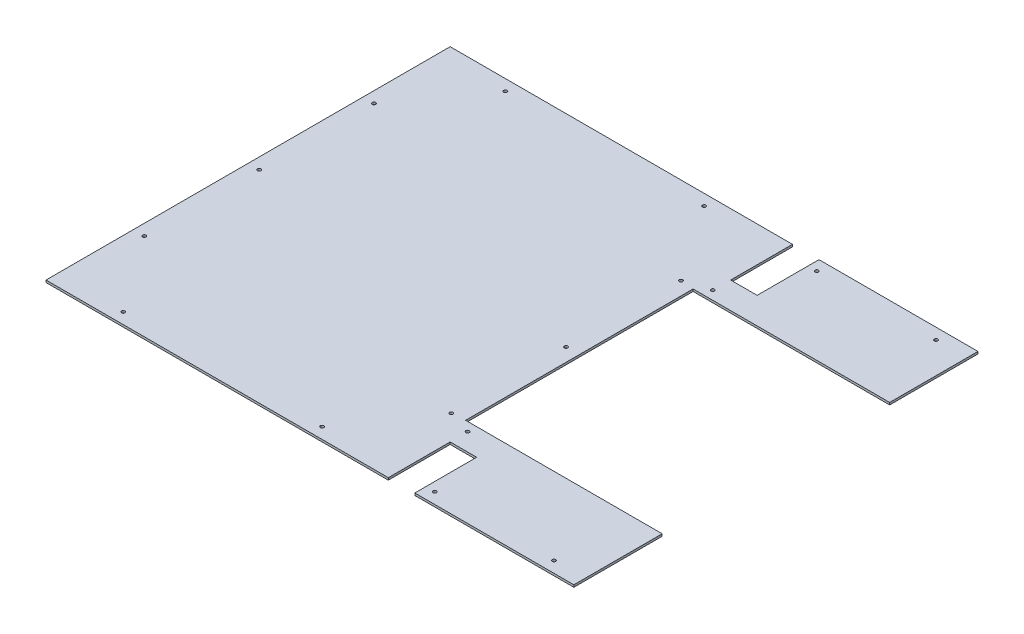
ISO-10303-21;
HEADER;
FILE_DESCRIPTION(('STEP AP214'),'2;1');
FILE_NAME('part.step','',(''),(''),'','','');
FILE_SCHEMA(('AUTOMOTIVE_DESIGN { 1 0 10303 214 1 1 1 1 }'));
ENDSEC;
DATA;
#1=APPLICATION_CONTEXT('core data for automotive mechanical design processes');
#2=APPLICATION_PROTOCOL_DEFINITION('international standard','automotive_design',2000,#1);
#3=PRODUCT_CONTEXT('',#1,'mechanical');
#4=PRODUCT('Part','Part','',(#3));
#5=PRODUCT_RELATED_PRODUCT_CATEGORY('part','',(#4));
#6=PRODUCT_DEFINITION_FORMATION('','',#4);
#7=PRODUCT_DEFINITION_CONTEXT('part definition',#1,'design');
#8=PRODUCT_DEFINITION('design','',#6,#7);
#9=PRODUCT_DEFINITION_SHAPE('','',#8);
#10=(LENGTH_UNIT() NAMED_UNIT(*) SI_UNIT(.MILLI.,.METRE.));
#11=(NAMED_UNIT(*) PLANE_ANGLE_UNIT() SI_UNIT($,.RADIAN.));
#12=(NAMED_UNIT(*) SI_UNIT($,.STERADIAN.) SOLID_ANGLE_UNIT());
#13=UNCERTAINTY_MEASURE_WITH_UNIT(LENGTH_MEASURE(1.E-05),#10,'distance_accuracy_value','');
#14=(GEOMETRIC_REPRESENTATION_CONTEXT(3) GLOBAL_UNCERTAINTY_ASSIGNED_CONTEXT((#13)) GLOBAL_UNIT_ASSIGNED_CONTEXT((#10,
#11,#12)) REPRESENTATION_CONTEXT('',''));
#15=CARTESIAN_POINT('',(0.,0.,0.));
#16=DIRECTION('',(0.,0.,1.));
#17=DIRECTION('',(1.,0.,0.));
#18=AXIS2_PLACEMENT_3D('',#15,#16,#17);
#19=CARTESIAN_POINT('',(0.,0.,0.));
#20=DIRECTION('',(0.,-1.,0.));
#21=DIRECTION('',(0.,0.,-1.));
#22=AXIS2_PLACEMENT_3D('',#19,#20,#21);
#23=PLANE('',#22);
#24=CARTESIAN_POINT('',(491.8075,0.,-114.3));
#25=DIRECTION('',(0.,1.,0.));
#26=DIRECTION('',(0.,0.,1.));
#27=AXIS2_PLACEMENT_3D('',#24,#25,#26);
#28=CIRCLE('',#27,2.45744999999997);
#29=CARTESIAN_POINT('',(491.8075,0.,-111.84255));
#30=VERTEX_POINT('',#29);
#31=EDGE_CURVE('E532',#30,#30,#28,.T.);
#32=ORIENTED_EDGE('',*,*,#31,.T.);
#33=EDGE_LOOP('',(#32));
#34=FACE_BOUND('',#33,.T.);
#35=CARTESIAN_POINT('',(542.925,0.,-15.875));
#36=DIRECTION('',(0.,1.,0.));
#37=DIRECTION('',(0.,0.,1.));
#38=AXIS2_PLACEMENT_3D('',#35,#36,#37);
#39=CIRCLE('',#38,2.45744999999997);
#40=CARTESIAN_POINT('',(542.925,0.,-13.41755));
#41=VERTEX_POINT('',#40);
#42=EDGE_CURVE('E537',#41,#41,#39,.T.);
#43=ORIENTED_EDGE('',*,*,#42,.T.);
#44=EDGE_LOOP('',(#43));
#45=FACE_BOUND('',#44,.T.);
#46=CARTESIAN_POINT('',(714.375,0.,-15.875));
#47=DIRECTION('',(0.,1.,0.));
#48=DIRECTION('',(0.,0.,1.));
#49=AXIS2_PLACEMENT_3D('',#46,#47,#48);
#50=CIRCLE('',#49,2.45744999999997);
#51=CARTESIAN_POINT('',(714.375,0.,-13.41755));
#52=VERTEX_POINT('',#51);
#53=EDGE_CURVE('E541',#52,#52,#50,.T.);
#54=ORIENTED_EDGE('',*,*,#53,.T.);
#55=EDGE_LOOP('',(#54));
#56=FACE_BOUND('',#55,.T.);
#57=CARTESIAN_POINT('',(491.8075,0.,-466.725));
#58=DIRECTION('',(0.,1.,0.));
#59=DIRECTION('',(0.,0.,1.));
#60=AXIS2_PLACEMENT_3D('',#57,#58,#59);
#61=CIRCLE('',#60,2.45744999999997);
#62=CARTESIAN_POINT('',(491.8075,0.,-464.26755));
#63=VERTEX_POINT('',#62);
#64=EDGE_CURVE('E545',#63,#63,#61,.T.);
#65=ORIENTED_EDGE('',*,*,#64,.T.);
#66=EDGE_LOOP('',(#65));
#67=FACE_BOUND('',#66,.T.);
#68=CARTESIAN_POINT('',(15.875,0.,-290.5125));
#69=DIRECTION('',(0.,1.,0.));
#70=DIRECTION('',(0.,0.,1.));
#71=AXIS2_PLACEMENT_3D('',#68,#69,#70);
#72=CIRCLE('',#71,2.45745);
#73=CARTESIAN_POINT('',(15.875,0.,-288.05505));
#74=VERTEX_POINT('',#73);
#75=EDGE_CURVE('E316',#74,#74,#72,.T.);
#76=ORIENTED_EDGE('',*,*,#75,.T.);
#77=EDGE_LOOP('',(#76));
#78=FACE_BOUND('',#77,.T.);
#79=CARTESIAN_POINT('',(381.,0.,-15.875));
#80=DIRECTION('',(0.,1.,0.));
#81=DIRECTION('',(0.,0.,1.));
#82=AXIS2_PLACEMENT_3D('',#79,#80,#81);
#83=CIRCLE('',#82,2.45744999999997);
#84=CARTESIAN_POINT('',(381.,0.,-13.41755));
#85=VERTEX_POINT('',#84);
#86=EDGE_CURVE('E322',#85,#85,#83,.T.);
#87=ORIENTED_EDGE('',*,*,#86,.T.);
#88=EDGE_LOOP('',(#87));
#89=FACE_BOUND('',#88,.T.);
#90=CARTESIAN_POINT('',(381.,0.,-565.15));
#91=DIRECTION('',(0.,1.,0.));
#92=DIRECTION('',(0.,0.,1.));
#93=AXIS2_PLACEMENT_3D('',#90,#91,#92);
#94=CIRCLE('',#93,2.45744999999997);
#95=CARTESIAN_POINT('',(381.,0.,-562.69255));
#96=VERTEX_POINT('',#95);
#97=EDGE_CURVE('E328',#96,#96,#94,.T.);
#98=ORIENTED_EDGE('',*,*,#97,.T.);
#99=EDGE_LOOP('',(#98));
#100=FACE_BOUND('',#99,.T.);
#101=CARTESIAN_POINT('',(95.25,0.,-565.15));
#102=DIRECTION('',(0.,1.,0.));
#103=DIRECTION('',(0.,0.,1.));
#104=AXIS2_PLACEMENT_3D('',#101,#102,#103);
#105=CIRCLE('',#104,2.45745);
#106=CARTESIAN_POINT('',(95.25,0.,-562.69255));
#107=VERTEX_POINT('',#106);
#108=EDGE_CURVE('E334',#107,#107,#105,.T.);
#109=ORIENTED_EDGE('',*,*,#108,.T.);
#110=EDGE_LOOP('',(#109));
#111=FACE_BOUND('',#110,.T.);
#112=CARTESIAN_POINT('',(95.2500000000001,0.,-15.875));
#113=DIRECTION('',(0.,1.,0.));
#114=DIRECTION('',(0.,0.,1.));
#115=AXIS2_PLACEMENT_3D('',#112,#113,#114);
#116=CIRCLE('',#115,2.45745);
#117=CARTESIAN_POINT('',(95.2500000000001,0.,-13.41755));
#118=VERTEX_POINT('',#117);
#119=EDGE_CURVE('E340',#118,#118,#116,.T.);
#120=ORIENTED_EDGE('',*,*,#119,.T.);
#121=EDGE_LOOP('',(#120));
#122=FACE_BOUND('',#121,.T.);
#123=CARTESIAN_POINT('',(457.2,0.,-125.4125));
#124=DIRECTION('',(0.,1.,0.));
#125=DIRECTION('',(0.,0.,1.));
#126=AXIS2_PLACEMENT_3D('',#123,#124,#125);
#127=CIRCLE('',#126,2.45744999999997);
#128=CARTESIAN_POINT('',(457.2,0.,-122.95505));
#129=VERTEX_POINT('',#128);
#130=EDGE_CURVE('E346',#129,#129,#127,.T.);
#131=ORIENTED_EDGE('',*,*,#130,.T.);
#132=EDGE_LOOP('',(#131));
#133=FACE_BOUND('',#132,.T.);
#134=CARTESIAN_POINT('',(457.2,0.,-455.6125));
#135=DIRECTION('',(0.,1.,0.));
#136=DIRECTION('',(0.,0.,1.));
#137=AXIS2_PLACEMENT_3D('',#134,#135,#136);
#138=CIRCLE('',#137,2.45744999999997);
#139=CARTESIAN_POINT('',(457.2,0.,-453.15505));
#140=VERTEX_POINT('',#139);
#141=EDGE_CURVE('E265',#140,#140,#138,.T.);
#142=ORIENTED_EDGE('',*,*,#141,.T.);
#143=EDGE_LOOP('',(#142));
#144=FACE_BOUND('',#143,.T.);
#145=CARTESIAN_POINT('',(457.2,0.,-290.5125));
#146=DIRECTION('',(0.,1.,0.));
#147=DIRECTION('',(0.,0.,1.));
#148=AXIS2_PLACEMENT_3D('',#145,#146,#147);
#149=CIRCLE('',#148,2.45744999999997);
#150=CARTESIAN_POINT('',(457.2,0.,-288.05505));
#151=VERTEX_POINT('',#150);
#152=EDGE_CURVE('E352',#151,#151,#149,.T.);
#153=ORIENTED_EDGE('',*,*,#152,.T.);
#154=EDGE_LOOP('',(#153));
#155=FACE_BOUND('',#154,.T.);
#156=CARTESIAN_POINT('',(15.875,0.,-125.4125));
#157=DIRECTION('',(0.,1.,0.));
#158=DIRECTION('',(0.,0.,1.));
#159=AXIS2_PLACEMENT_3D('',#156,#157,#158);
#160=CIRCLE('',#159,2.45745);
#161=CARTESIAN_POINT('',(15.875,0.,-122.95505));
#162=VERTEX_POINT('',#161);
#163=EDGE_CURVE('E310',#162,#162,#160,.T.);
#164=ORIENTED_EDGE('',*,*,#163,.T.);
#165=EDGE_LOOP('',(#164));
#166=FACE_BOUND('',#165,.T.);
#167=CARTESIAN_POINT('',(15.875,0.,-455.6125));
#168=DIRECTION('',(0.,1.,0.));
#169=DIRECTION('',(0.,0.,1.));
#170=AXIS2_PLACEMENT_3D('',#167,#168,#169);
#171=CIRCLE('',#170,2.45745);
#172=CARTESIAN_POINT('',(15.875,0.,-453.15505));
#173=VERTEX_POINT('',#172);
#174=EDGE_CURVE('E304',#173,#173,#171,.T.);
#175=ORIENTED_EDGE('',*,*,#174,.T.);
#176=EDGE_LOOP('',(#175));
#177=FACE_BOUND('',#176,.T.);
#178=DIRECTION('',(0.,0.,1.));
#179=VECTOR('',#178,1.);
#180=CARTESIAN_POINT('',(492.125,0.,0.));
#181=LINE('',#180,#179);
#182=CARTESIAN_POINT('',(492.125,0.,-88.9));
#183=VERTEX_POINT('',#182);
#184=CARTESIAN_POINT('',(492.125,0.,0.));
#185=VERTEX_POINT('',#184);
#186=EDGE_CURVE('E149',#183,#185,#181,.T.);
#187=ORIENTED_EDGE('',*,*,#186,.T.);
#188=DIRECTION('',(1.,0.,0.));
#189=VECTOR('',#188,1.);
#190=CARTESIAN_POINT('',(447.675,0.,0.));
#191=LINE('',#190,#189);
#192=CARTESIAN_POINT('',(0.,0.,0.));
#193=VERTEX_POINT('',#192);
#194=EDGE_CURVE('E162',#193,#185,#191,.T.);
#195=ORIENTED_EDGE('',*,*,#194,.F.);
#196=DIRECTION('',(0.,0.,1.));
#197=VECTOR('',#196,1.);
#198=CARTESIAN_POINT('',(0.,0.,0.));
#199=LINE('',#198,#197);
#200=CARTESIAN_POINT('',(0.,0.,-581.025));
#201=VERTEX_POINT('',#200);
#202=EDGE_CURVE('E174',#201,#193,#199,.T.);
#203=ORIENTED_EDGE('',*,*,#202,.F.);
#204=DIRECTION('',(-1.,0.,0.));
#205=VECTOR('',#204,1.);
#206=CARTESIAN_POINT('',(0.,0.,-581.025));
#207=LINE('',#206,#205);
#208=CARTESIAN_POINT('',(492.125,0.,-581.025));
#209=VERTEX_POINT('',#208);
#210=EDGE_CURVE('E186',#209,#201,#207,.T.);
#211=ORIENTED_EDGE('',*,*,#210,.F.);
#212=DIRECTION('',(0.,0.,1.));
#213=VECTOR('',#212,1.);
#214=CARTESIAN_POINT('',(492.125,0.,-581.025));
#215=LINE('',#214,#213);
#216=CARTESIAN_POINT('',(492.125,0.,-492.125));
#217=VERTEX_POINT('',#216);
#218=EDGE_CURVE('E278',#209,#217,#215,.T.);
#219=ORIENTED_EDGE('',*,*,#218,.T.);
#220=DIRECTION('',(1.,0.,0.));
#221=VECTOR('',#220,1.);
#222=CARTESIAN_POINT('',(492.125,0.,-492.125));
#223=LINE('',#222,#221);
#224=CARTESIAN_POINT('',(530.225,0.,-492.125));
#225=VERTEX_POINT('',#224);
#226=EDGE_CURVE('E281',#217,#225,#223,.T.);
#227=ORIENTED_EDGE('',*,*,#226,.T.);
#228=DIRECTION('',(0.,0.,-1.));
#229=VECTOR('',#228,1.);
#230=CARTESIAN_POINT('',(530.225,0.,-581.025));
#231=LINE('',#230,#229);
#232=CARTESIAN_POINT('',(530.225,0.,-581.025));
#233=VERTEX_POINT('',#232);
#234=EDGE_CURVE('E284',#225,#233,#231,.T.);
#235=ORIENTED_EDGE('',*,*,#234,.T.);
#236=CARTESIAN_POINT('',(758.825,0.,-581.025));
#237=VERTEX_POINT('',#236);
#238=EDGE_CURVE('E187',#237,#233,#207,.T.);
#239=ORIENTED_EDGE('',*,*,#238,.F.);
#240=DIRECTION('',(0.,0.,-1.));
#241=VECTOR('',#240,1.);
#242=CARTESIAN_POINT('',(758.825,0.,-581.025));
#243=LINE('',#242,#241);
#244=CARTESIAN_POINT('',(758.825,0.,-454.025));
#245=VERTEX_POINT('',#244);
#246=EDGE_CURVE('E183',#245,#237,#243,.T.);
#247=ORIENTED_EDGE('',*,*,#246,.F.);
#248=DIRECTION('',(1.,0.,0.));
#249=VECTOR('',#248,1.);
#250=CARTESIAN_POINT('',(758.825,0.,-454.025));
#251=LINE('',#250,#249);
#252=CARTESIAN_POINT('',(476.25,0.,-454.025));
#253=VERTEX_POINT('',#252);
#254=EDGE_CURVE('E181',#253,#245,#251,.T.);
#255=ORIENTED_EDGE('',*,*,#254,.F.);
#256=DIRECTION('',(0.,0.,-1.));
#257=VECTOR('',#256,1.);
#258=CARTESIAN_POINT('',(476.25,0.,-127.));
#259=LINE('',#258,#257);
#260=CARTESIAN_POINT('',(476.25,0.,-127.));
#261=VERTEX_POINT('',#260);
#262=EDGE_CURVE('E179',#261,#253,#259,.T.);
#263=ORIENTED_EDGE('',*,*,#262,.F.);
#264=DIRECTION('',(-1.,0.,0.));
#265=VECTOR('',#264,1.);
#266=CARTESIAN_POINT('',(758.825,0.,-127.));
#267=LINE('',#266,#265);
#268=CARTESIAN_POINT('',(758.825,0.,-127.));
#269=VERTEX_POINT('',#268);
#270=EDGE_CURVE('E172',#269,#261,#267,.T.);
#271=ORIENTED_EDGE('',*,*,#270,.F.);
#272=DIRECTION('',(0.,0.,-1.));
#273=VECTOR('',#272,1.);
#274=CARTESIAN_POINT('',(758.825,0.,0.));
#275=LINE('',#274,#273);
#276=CARTESIAN_POINT('',(758.825,0.,0.));
#277=VERTEX_POINT('',#276);
#278=EDGE_CURVE('E169',#277,#269,#275,.T.);
#279=ORIENTED_EDGE('',*,*,#278,.F.);
#280=CARTESIAN_POINT('',(530.225,0.,0.));
#281=VERTEX_POINT('',#280);
#282=EDGE_CURVE('E170',#281,#277,#191,.T.);
#283=ORIENTED_EDGE('',*,*,#282,.F.);
#284=DIRECTION('',(0.,0.,-1.));
#285=VECTOR('',#284,1.);
#286=CARTESIAN_POINT('',(530.225,0.,0.));
#287=LINE('',#286,#285);
#288=CARTESIAN_POINT('',(530.225,0.,-88.9));
#289=VERTEX_POINT('',#288);
#290=EDGE_CURVE('E48',#281,#289,#287,.T.);
#291=ORIENTED_EDGE('',*,*,#290,.T.);
#292=DIRECTION('',(-1.,0.,0.));
#293=VECTOR('',#292,1.);
#294=CARTESIAN_POINT('',(492.125,0.,-88.9));
#295=LINE('',#294,#293);
#296=EDGE_CURVE('E157',#289,#183,#295,.T.);
#297=ORIENTED_EDGE('',*,*,#296,.T.);
#298=EDGE_LOOP('',(#187,#195,#203,#211,#219,#227,#235,#239,#247,#255,#263,#271,#279,#283,#291,#297));
#299=FACE_BOUND('',#298,.T.);
#300=CARTESIAN_POINT('',(714.375,0.,-565.15));
#301=DIRECTION('',(0.,1.,0.));
#302=DIRECTION('',(0.,0.,1.));
#303=AXIS2_PLACEMENT_3D('',#300,#301,#302);
#304=CIRCLE('',#303,2.45744999999997);
#305=CARTESIAN_POINT('',(714.375,0.,-562.69255));
#306=VERTEX_POINT('',#305);
#307=EDGE_CURVE('E290',#306,#306,#304,.T.);
#308=ORIENTED_EDGE('',*,*,#307,.T.);
#309=EDGE_LOOP('',(#308));
#310=FACE_BOUND('',#309,.T.);
#311=CARTESIAN_POINT('',(542.925,0.,-565.15));
#312=DIRECTION('',(0.,1.,0.));
#313=DIRECTION('',(0.,0.,1.));
#314=AXIS2_PLACEMENT_3D('',#311,#312,#313);
#315=CIRCLE('',#314,2.45744999999997);
#316=CARTESIAN_POINT('',(542.925,0.,-562.69255));
#317=VERTEX_POINT('',#316);
#318=EDGE_CURVE('E549',#317,#317,#315,.T.);
#319=ORIENTED_EDGE('',*,*,#318,.T.);
#320=EDGE_LOOP('',(#319));
#321=FACE_BOUND('',#320,.T.);
#322=ADVANCED_FACE('F33',(#34,#45,#56,#67,#78,#89,#100,#111,#122,#133,#144,#155,#166,#177,#299,
#310,#321),#23,.T.);
#323=CARTESIAN_POINT('',(447.675,3.175,0.));
#324=DIRECTION('',(0.,0.,-1.));
#325=DIRECTION('',(-1.,0.,0.));
#326=AXIS2_PLACEMENT_3D('',#323,#324,#325);
#327=PLANE('',#326);
#328=ORIENTED_EDGE('',*,*,#194,.T.);
#329=DIRECTION('',(0.,1.,0.));
#330=VECTOR('',#329,1.);
#331=CARTESIAN_POINT('',(492.125,0.,0.));
#332=LINE('',#331,#330);
#333=CARTESIAN_POINT('',(492.125,3.175,0.));
#334=VERTEX_POINT('',#333);
#335=EDGE_CURVE('E146',#185,#334,#332,.T.);
#336=ORIENTED_EDGE('',*,*,#335,.T.);
#337=DIRECTION('',(1.,0.,0.));
#338=VECTOR('',#337,1.);
#339=CARTESIAN_POINT('',(0.,3.175,0.));
#340=LINE('',#339,#338);
#341=CARTESIAN_POINT('',(0.,3.175,0.));
#342=VERTEX_POINT('',#341);
#343=EDGE_CURVE('E262',#342,#334,#340,.T.);
#344=ORIENTED_EDGE('',*,*,#343,.F.);
#345=DIRECTION('',(0.,-1.,0.));
#346=VECTOR('',#345,1.);
#347=CARTESIAN_POINT('',(0.,3.175,0.));
#348=LINE('',#347,#346);
#349=EDGE_CURVE('E11',#342,#193,#348,.T.);
#350=ORIENTED_EDGE('',*,*,#349,.T.);
#351=EDGE_LOOP('',(#328,#336,#344,#350));
#352=FACE_BOUND('',#351,.T.);
#353=ADVANCED_FACE('F166',(#352),#327,.F.);
#354=CARTESIAN_POINT('',(0.,3.175,-581.025));
#355=DIRECTION('',(0.,0.,1.));
#356=DIRECTION('',(1.,0.,0.));
#357=AXIS2_PLACEMENT_3D('',#354,#355,#356);
#358=PLANE('',#357);
#359=DIRECTION('',(-1.,0.,0.));
#360=VECTOR('',#359,1.);
#361=CARTESIAN_POINT('',(476.25,3.175,-581.025));
#362=LINE('',#361,#360);
#363=CARTESIAN_POINT('',(492.125,3.175,-581.025));
#364=VERTEX_POINT('',#363);
#365=CARTESIAN_POINT('',(0.,3.175,-581.025));
#366=VERTEX_POINT('',#365);
#367=EDGE_CURVE('E242',#364,#366,#362,.T.);
#368=ORIENTED_EDGE('',*,*,#367,.F.);
#369=DIRECTION('',(0.,1.,0.));
#370=VECTOR('',#369,1.);
#371=CARTESIAN_POINT('',(492.125,0.,-581.025));
#372=LINE('',#371,#370);
#373=EDGE_CURVE('E294',#209,#364,#372,.T.);
#374=ORIENTED_EDGE('',*,*,#373,.F.);
#375=ORIENTED_EDGE('',*,*,#210,.T.);
#376=DIRECTION('',(0.,-1.,0.));
#377=VECTOR('',#376,1.);
#378=CARTESIAN_POINT('',(0.,3.175,-581.025));
#379=LINE('',#378,#377);
#380=EDGE_CURVE('E191',#366,#201,#379,.T.);
#381=ORIENTED_EDGE('',*,*,#380,.F.);
#382=EDGE_LOOP('',(#368,#374,#375,#381));
#383=FACE_BOUND('',#382,.T.);
#384=ADVANCED_FACE('F257',(#383),#358,.F.);
#385=CARTESIAN_POINT('',(0.,3.175,0.));
#386=DIRECTION('',(0.,-1.,0.));
#387=DIRECTION('',(0.,0.,-1.));
#388=AXIS2_PLACEMENT_3D('',#385,#386,#387);
#389=PLANE('',#388);
#390=CARTESIAN_POINT('',(491.8075,3.175,-114.3));
#391=DIRECTION('',(0.,1.,0.));
#392=DIRECTION('',(0.,0.,1.));
#393=AXIS2_PLACEMENT_3D('',#390,#391,#392);
#394=CIRCLE('',#393,2.45744999999997);
#395=CARTESIAN_POINT('',(491.8075,3.175,-111.84255));
#396=VERTEX_POINT('',#395);
#397=EDGE_CURVE('E415',#396,#396,#394,.T.);
#398=ORIENTED_EDGE('',*,*,#397,.F.);
#399=EDGE_LOOP('',(#398));
#400=FACE_BOUND('',#399,.T.);
#401=CARTESIAN_POINT('',(542.925,3.175,-15.875));
#402=DIRECTION('',(0.,1.,0.));
#403=DIRECTION('',(0.,0.,1.));
#404=AXIS2_PLACEMENT_3D('',#401,#402,#403);
#405=CIRCLE('',#404,2.45744999999997);
#406=CARTESIAN_POINT('',(542.925,3.175,-13.41755));
#407=VERTEX_POINT('',#406);
#408=EDGE_CURVE('E419',#407,#407,#405,.T.);
#409=ORIENTED_EDGE('',*,*,#408,.F.);
#410=EDGE_LOOP('',(#409));
#411=FACE_BOUND('',#410,.T.);
#412=CARTESIAN_POINT('',(714.375,3.175,-15.875));
#413=DIRECTION('',(0.,1.,0.));
#414=DIRECTION('',(0.,0.,1.));
#415=AXIS2_PLACEMENT_3D('',#412,#413,#414);
#416=CIRCLE('',#415,2.45744999999997);
#417=CARTESIAN_POINT('',(714.375,3.175,-13.41755));
#418=VERTEX_POINT('',#417);
#419=EDGE_CURVE('E423',#418,#418,#416,.T.);
#420=ORIENTED_EDGE('',*,*,#419,.F.);
#421=EDGE_LOOP('',(#420));
#422=FACE_BOUND('',#421,.T.);
#423=CARTESIAN_POINT('',(491.8075,3.175,-466.725));
#424=DIRECTION('',(0.,1.,0.));
#425=DIRECTION('',(0.,0.,1.));
#426=AXIS2_PLACEMENT_3D('',#423,#424,#425);
#427=CIRCLE('',#426,2.45744999999997);
#428=CARTESIAN_POINT('',(491.8075,3.175,-464.26755));
#429=VERTEX_POINT('',#428);
#430=EDGE_CURVE('E427',#429,#429,#427,.T.);
#431=ORIENTED_EDGE('',*,*,#430,.F.);
#432=EDGE_LOOP('',(#431));
#433=FACE_BOUND('',#432,.T.);
#434=CARTESIAN_POINT('',(542.925,3.175,-565.15));
#435=DIRECTION('',(0.,1.,0.));
#436=DIRECTION('',(0.,0.,1.));
#437=AXIS2_PLACEMENT_3D('',#434,#435,#436);
#438=CIRCLE('',#437,2.45744999999997);
#439=CARTESIAN_POINT('',(542.925,3.175,-562.69255));
#440=VERTEX_POINT('',#439);
#441=EDGE_CURVE('E431',#440,#440,#438,.T.);
#442=ORIENTED_EDGE('',*,*,#441,.F.);
#443=EDGE_LOOP('',(#442));
#444=FACE_BOUND('',#443,.T.);
#445=CARTESIAN_POINT('',(714.375,3.175,-565.15));
#446=DIRECTION('',(0.,1.,0.));
#447=DIRECTION('',(0.,0.,1.));
#448=AXIS2_PLACEMENT_3D('',#445,#446,#447);
#449=CIRCLE('',#448,2.45744999999997);
#450=CARTESIAN_POINT('',(714.375,3.175,-562.69255));
#451=VERTEX_POINT('',#450);
#452=EDGE_CURVE('E435',#451,#451,#449,.T.);
#453=ORIENTED_EDGE('',*,*,#452,.F.);
#454=EDGE_LOOP('',(#453));
#455=FACE_BOUND('',#454,.T.);
#456=CARTESIAN_POINT('',(15.875,3.175,-125.4125));
#457=DIRECTION('',(0.,1.,0.));
#458=DIRECTION('',(0.,0.,1.));
#459=AXIS2_PLACEMENT_3D('',#456,#457,#458);
#460=CIRCLE('',#459,2.45744999999999);
#461=CARTESIAN_POINT('',(15.875,3.175,-122.95505));
#462=VERTEX_POINT('',#461);
#463=EDGE_CURVE('E307',#462,#462,#460,.T.);
#464=ORIENTED_EDGE('',*,*,#463,.F.);
#465=EDGE_LOOP('',(#464));
#466=FACE_BOUND('',#465,.T.);
#467=CARTESIAN_POINT('',(381.,3.175,-15.875));
#468=DIRECTION('',(0.,1.,0.));
#469=DIRECTION('',(0.,0.,1.));
#470=AXIS2_PLACEMENT_3D('',#467,#468,#469);
#471=CIRCLE('',#470,2.45744999999997);
#472=CARTESIAN_POINT('',(381.,3.175,-13.41755));
#473=VERTEX_POINT('',#472);
#474=EDGE_CURVE('E319',#473,#473,#471,.T.);
#475=ORIENTED_EDGE('',*,*,#474,.F.);
#476=EDGE_LOOP('',(#475));
#477=FACE_BOUND('',#476,.T.);
#478=CARTESIAN_POINT('',(381.,3.175,-565.15));
#479=DIRECTION('',(0.,1.,0.));
#480=DIRECTION('',(0.,0.,1.));
#481=AXIS2_PLACEMENT_3D('',#478,#479,#480);
#482=CIRCLE('',#481,2.45744999999997);
#483=CARTESIAN_POINT('',(381.,3.175,-562.69255));
#484=VERTEX_POINT('',#483);
#485=EDGE_CURVE('E325',#484,#484,#482,.T.);
#486=ORIENTED_EDGE('',*,*,#485,.F.);
#487=EDGE_LOOP('',(#486));
#488=FACE_BOUND('',#487,.T.);
#489=CARTESIAN_POINT('',(95.25,3.175,-565.15));
#490=DIRECTION('',(0.,1.,0.));
#491=DIRECTION('',(0.,0.,1.));
#492=AXIS2_PLACEMENT_3D('',#489,#490,#491);
#493=CIRCLE('',#492,2.45744999999999);
#494=CARTESIAN_POINT('',(95.25,3.175,-562.69255));
#495=VERTEX_POINT('',#494);
#496=EDGE_CURVE('E331',#495,#495,#493,.T.);
#497=ORIENTED_EDGE('',*,*,#496,.F.);
#498=EDGE_LOOP('',(#497));
#499=FACE_BOUND('',#498,.T.);
#500=CARTESIAN_POINT('',(95.2500000000001,3.175,-15.875));
#501=DIRECTION('',(0.,1.,0.));
#502=DIRECTION('',(0.,0.,1.));
#503=AXIS2_PLACEMENT_3D('',#500,#501,#502);
#504=CIRCLE('',#503,2.45744999999999);
#505=CARTESIAN_POINT('',(95.2500000000001,3.175,-13.41755));
#506=VERTEX_POINT('',#505);
#507=EDGE_CURVE('E337',#506,#506,#504,.T.);
#508=ORIENTED_EDGE('',*,*,#507,.F.);
#509=EDGE_LOOP('',(#508));
#510=FACE_BOUND('',#509,.T.);
#511=CARTESIAN_POINT('',(457.2,3.175,-125.4125));
#512=DIRECTION('',(0.,1.,0.));
#513=DIRECTION('',(0.,0.,1.));
#514=AXIS2_PLACEMENT_3D('',#511,#512,#513);
#515=CIRCLE('',#514,2.45744999999997);
#516=CARTESIAN_POINT('',(457.2,3.175,-122.95505));
#517=VERTEX_POINT('',#516);
#518=EDGE_CURVE('E343',#517,#517,#515,.T.);
#519=ORIENTED_EDGE('',*,*,#518,.F.);
#520=EDGE_LOOP('',(#519));
#521=FACE_BOUND('',#520,.T.);
#522=CARTESIAN_POINT('',(457.2,3.175,-290.5125));
#523=DIRECTION('',(0.,1.,0.));
#524=DIRECTION('',(0.,0.,1.));
#525=AXIS2_PLACEMENT_3D('',#522,#523,#524);
#526=CIRCLE('',#525,2.45744999999997);
#527=CARTESIAN_POINT('',(457.2,3.175,-288.05505));
#528=VERTEX_POINT('',#527);
#529=EDGE_CURVE('E349',#528,#528,#526,.T.);
#530=ORIENTED_EDGE('',*,*,#529,.F.);
#531=EDGE_LOOP('',(#530));
#532=FACE_BOUND('',#531,.T.);
#533=CARTESIAN_POINT('',(457.2,3.175,-455.6125));
#534=DIRECTION('',(0.,1.,0.));
#535=DIRECTION('',(0.,0.,1.));
#536=AXIS2_PLACEMENT_3D('',#533,#534,#535);
#537=CIRCLE('',#536,2.45744999999997);
#538=CARTESIAN_POINT('',(457.2,3.175,-453.15505));
#539=VERTEX_POINT('',#538);
#540=EDGE_CURVE('E354',#539,#539,#537,.T.);
#541=ORIENTED_EDGE('',*,*,#540,.F.);
#542=EDGE_LOOP('',(#541));
#543=FACE_BOUND('',#542,.T.);
#544=ORIENTED_EDGE('',*,*,#343,.T.);
#545=DIRECTION('',(0.,0.,1.));
#546=VECTOR('',#545,1.);
#547=CARTESIAN_POINT('',(492.125,3.175,0.));
#548=LINE('',#547,#546);
#549=CARTESIAN_POINT('',(492.125,3.175,-88.9));
#550=VERTEX_POINT('',#549);
#551=EDGE_CURVE('E152',#550,#334,#548,.T.);
#552=ORIENTED_EDGE('',*,*,#551,.F.);
#553=DIRECTION('',(-1.,0.,0.));
#554=VECTOR('',#553,1.);
#555=CARTESIAN_POINT('',(492.125,3.175,-88.9));
#556=LINE('',#555,#554);
#557=CARTESIAN_POINT('',(530.225,3.175,-88.9));
#558=VERTEX_POINT('',#557);
#559=EDGE_CURVE('E164',#558,#550,#556,.T.);
#560=ORIENTED_EDGE('',*,*,#559,.F.);
#561=DIRECTION('',(0.,0.,-1.));
#562=VECTOR('',#561,1.);
#563=CARTESIAN_POINT('',(530.225,3.175,0.));
#564=LINE('',#563,#562);
#565=CARTESIAN_POINT('',(530.225,3.175,0.));
#566=VERTEX_POINT('',#565);
#567=EDGE_CURVE('E270',#566,#558,#564,.T.);
#568=ORIENTED_EDGE('',*,*,#567,.F.);
#569=CARTESIAN_POINT('',(758.825,3.175,0.));
#570=VERTEX_POINT('',#569);
#571=EDGE_CURVE('E260',#566,#570,#340,.T.);
#572=ORIENTED_EDGE('',*,*,#571,.T.);
#573=DIRECTION('',(0.,0.,-1.));
#574=VECTOR('',#573,1.);
#575=CARTESIAN_POINT('',(758.825,3.175,0.));
#576=LINE('',#575,#574);
#577=CARTESIAN_POINT('',(758.825,3.175,-127.));
#578=VERTEX_POINT('',#577);
#579=EDGE_CURVE('E216',#570,#578,#576,.T.);
#580=ORIENTED_EDGE('',*,*,#579,.T.);
#581=DIRECTION('',(-1.,0.,0.));
#582=VECTOR('',#581,1.);
#583=CARTESIAN_POINT('',(758.825,3.175,-127.));
#584=LINE('',#583,#582);
#585=CARTESIAN_POINT('',(476.25,3.175,-127.));
#586=VERTEX_POINT('',#585);
#587=EDGE_CURVE('E235',#578,#586,#584,.T.);
#588=ORIENTED_EDGE('',*,*,#587,.T.);
#589=DIRECTION('',(0.,0.,-1.));
#590=VECTOR('',#589,1.);
#591=CARTESIAN_POINT('',(476.25,3.175,-127.));
#592=LINE('',#591,#590);
#593=CARTESIAN_POINT('',(476.25,3.175,-454.025));
#594=VERTEX_POINT('',#593);
#595=EDGE_CURVE('E231',#586,#594,#592,.T.);
#596=ORIENTED_EDGE('',*,*,#595,.T.);
#597=DIRECTION('',(1.,0.,0.));
#598=VECTOR('',#597,1.);
#599=CARTESIAN_POINT('',(758.825,3.175,-454.025));
#600=LINE('',#599,#598);
#601=CARTESIAN_POINT('',(758.825,3.175,-454.025));
#602=VERTEX_POINT('',#601);
#603=EDGE_CURVE('E234',#594,#602,#600,.T.);
#604=ORIENTED_EDGE('',*,*,#603,.T.);
#605=DIRECTION('',(0.,0.,-1.));
#606=VECTOR('',#605,1.);
#607=CARTESIAN_POINT('',(758.825,3.175,-581.025));
#608=LINE('',#607,#606);
#609=CARTESIAN_POINT('',(758.825,3.175,-581.025));
#610=VERTEX_POINT('',#609);
#611=EDGE_CURVE('E237',#602,#610,#608,.T.);
#612=ORIENTED_EDGE('',*,*,#611,.T.);
#613=CARTESIAN_POINT('',(530.225,3.175,-581.025));
#614=VERTEX_POINT('',#613);
#615=EDGE_CURVE('E195',#610,#614,#362,.T.);
#616=ORIENTED_EDGE('',*,*,#615,.T.);
#617=DIRECTION('',(0.,0.,-1.));
#618=VECTOR('',#617,1.);
#619=CARTESIAN_POINT('',(530.225,3.175,-581.025));
#620=LINE('',#619,#618);
#621=CARTESIAN_POINT('',(530.225,3.175,-492.125));
#622=VERTEX_POINT('',#621);
#623=EDGE_CURVE('E56',#622,#614,#620,.T.);
#624=ORIENTED_EDGE('',*,*,#623,.F.);
#625=DIRECTION('',(1.,0.,0.));
#626=VECTOR('',#625,1.);
#627=CARTESIAN_POINT('',(492.125,3.175,-492.125));
#628=LINE('',#627,#626);
#629=CARTESIAN_POINT('',(492.125,3.175,-492.125));
#630=VERTEX_POINT('',#629);
#631=EDGE_CURVE('E289',#630,#622,#628,.T.);
#632=ORIENTED_EDGE('',*,*,#631,.F.);
#633=DIRECTION('',(0.,0.,1.));
#634=VECTOR('',#633,1.);
#635=CARTESIAN_POINT('',(492.125,3.175,-581.025));
#636=LINE('',#635,#634);
#637=EDGE_CURVE('E254',#364,#630,#636,.T.);
#638=ORIENTED_EDGE('',*,*,#637,.F.);
#639=ORIENTED_EDGE('',*,*,#367,.T.);
#640=DIRECTION('',(0.,0.,1.));
#641=VECTOR('',#640,1.);
#642=CARTESIAN_POINT('',(0.,3.175,0.));
#643=LINE('',#642,#641);
#644=EDGE_CURVE('E190',#366,#342,#643,.T.);
#645=ORIENTED_EDGE('',*,*,#644,.T.);
#646=EDGE_LOOP('',(#544,#552,#560,#568,#572,#580,#588,#596,#604,#612,#616,#624,#632,#638,#639,#645));
#647=FACE_BOUND('',#646,.T.);
#648=CARTESIAN_POINT('',(15.875,3.175,-290.5125));
#649=DIRECTION('',(0.,1.,0.));
#650=DIRECTION('',(0.,0.,1.));
#651=AXIS2_PLACEMENT_3D('',#648,#649,#650);
#652=CIRCLE('',#651,2.45744999999999);
#653=CARTESIAN_POINT('',(15.875,3.175,-288.05505));
#654=VERTEX_POINT('',#653);
#655=EDGE_CURVE('E313',#654,#654,#652,.T.);
#656=ORIENTED_EDGE('',*,*,#655,.F.);
#657=EDGE_LOOP('',(#656));
#658=FACE_BOUND('',#657,.T.);
#659=CARTESIAN_POINT('',(15.875,3.175,-455.6125));
#660=DIRECTION('',(0.,1.,0.));
#661=DIRECTION('',(0.,0.,1.));
#662=AXIS2_PLACEMENT_3D('',#659,#660,#661);
#663=CIRCLE('',#662,2.45744999999999);
#664=CARTESIAN_POINT('',(15.875,3.175,-453.15505));
#665=VERTEX_POINT('',#664);
#666=EDGE_CURVE('E301',#665,#665,#663,.T.);
#667=ORIENTED_EDGE('',*,*,#666,.F.);
#668=EDGE_LOOP('',(#667));
#669=FACE_BOUND('',#668,.T.);
#670=ADVANCED_FACE('F249',(#400,#411,#422,#433,#444,#455,#466,#477,#488,#499,#510,#521,#532,
#543,#647,#658,#669),#389,.F.);
#671=CARTESIAN_POINT('',(0.,3.175,0.));
#672=DIRECTION('',(1.,0.,0.));
#673=DIRECTION('',(0.,0.,-1.));
#674=AXIS2_PLACEMENT_3D('',#671,#672,#673);
#675=PLANE('',#674);
#676=ORIENTED_EDGE('',*,*,#202,.T.);
#677=ORIENTED_EDGE('',*,*,#349,.F.);
#678=ORIENTED_EDGE('',*,*,#644,.F.);
#679=ORIENTED_EDGE('',*,*,#380,.T.);
#680=EDGE_LOOP('',(#676,#677,#678,#679));
#681=FACE_BOUND('',#680,.T.);
#682=ADVANCED_FACE('F35',(#681),#675,.F.);
#683=ORIENTED_EDGE('',*,*,#571,.F.);
#684=DIRECTION('',(0.,1.,0.));
#685=VECTOR('',#684,1.);
#686=CARTESIAN_POINT('',(530.225,0.,0.));
#687=LINE('',#686,#685);
#688=EDGE_CURVE('E156',#281,#566,#687,.T.);
#689=ORIENTED_EDGE('',*,*,#688,.F.);
#690=ORIENTED_EDGE('',*,*,#282,.T.);
#691=DIRECTION('',(0.,-1.,0.));
#692=VECTOR('',#691,1.);
#693=CARTESIAN_POINT('',(758.825,3.175,0.));
#694=LINE('',#693,#692);
#695=EDGE_CURVE('E41',#570,#277,#694,.T.);
#696=ORIENTED_EDGE('',*,*,#695,.F.);
#697=EDGE_LOOP('',(#683,#689,#690,#696));
#698=FACE_BOUND('',#697,.T.);
#699=ADVANCED_FACE('F271',(#698),#327,.F.);
#700=CARTESIAN_POINT('',(758.825,3.175,0.));
#701=DIRECTION('',(-1.,0.,0.));
#702=DIRECTION('',(0.,0.,1.));
#703=AXIS2_PLACEMENT_3D('',#700,#701,#702);
#704=PLANE('',#703);
#705=ORIENTED_EDGE('',*,*,#278,.T.);
#706=DIRECTION('',(0.,-1.,0.));
#707=VECTOR('',#706,1.);
#708=CARTESIAN_POINT('',(758.825,3.175,-127.));
#709=LINE('',#708,#707);
#710=EDGE_CURVE('E207',#578,#269,#709,.T.);
#711=ORIENTED_EDGE('',*,*,#710,.F.);
#712=ORIENTED_EDGE('',*,*,#579,.F.);
#713=ORIENTED_EDGE('',*,*,#695,.T.);
#714=EDGE_LOOP('',(#705,#711,#712,#713));
#715=FACE_BOUND('',#714,.T.);
#716=ADVANCED_FACE('F214',(#715),#704,.F.);
#717=CARTESIAN_POINT('',(758.825,3.175,-127.));
#718=DIRECTION('',(0.,0.,1.));
#719=DIRECTION('',(1.,0.,0.));
#720=AXIS2_PLACEMENT_3D('',#717,#718,#719);
#721=PLANE('',#720);
#722=ORIENTED_EDGE('',*,*,#270,.T.);
#723=DIRECTION('',(0.,-1.,0.));
#724=VECTOR('',#723,1.);
#725=CARTESIAN_POINT('',(476.25,3.175,-127.));
#726=LINE('',#725,#724);
#727=EDGE_CURVE('E204',#586,#261,#726,.T.);
#728=ORIENTED_EDGE('',*,*,#727,.F.);
#729=ORIENTED_EDGE('',*,*,#587,.F.);
#730=ORIENTED_EDGE('',*,*,#710,.T.);
#731=EDGE_LOOP('',(#722,#728,#729,#730));
#732=FACE_BOUND('',#731,.T.);
#733=ADVANCED_FACE('F225',(#732),#721,.F.);
#734=CARTESIAN_POINT('',(476.25,3.175,-127.));
#735=DIRECTION('',(-1.,0.,0.));
#736=DIRECTION('',(0.,0.,1.));
#737=AXIS2_PLACEMENT_3D('',#734,#735,#736);
#738=PLANE('',#737);
#739=ORIENTED_EDGE('',*,*,#262,.T.);
#740=DIRECTION('',(0.,-1.,0.));
#741=VECTOR('',#740,1.);
#742=CARTESIAN_POINT('',(476.25,3.175,-454.025));
#743=LINE('',#742,#741);
#744=EDGE_CURVE('E201',#594,#253,#743,.T.);
#745=ORIENTED_EDGE('',*,*,#744,.F.);
#746=ORIENTED_EDGE('',*,*,#595,.F.);
#747=ORIENTED_EDGE('',*,*,#727,.T.);
#748=EDGE_LOOP('',(#739,#745,#746,#747));
#749=FACE_BOUND('',#748,.T.);
#750=ADVANCED_FACE('F229',(#749),#738,.F.);
#751=CARTESIAN_POINT('',(758.825,3.175,-454.025));
#752=DIRECTION('',(0.,0.,-1.));
#753=DIRECTION('',(-1.,0.,0.));
#754=AXIS2_PLACEMENT_3D('',#751,#752,#753);
#755=PLANE('',#754);
#756=ORIENTED_EDGE('',*,*,#254,.T.);
#757=DIRECTION('',(0.,-1.,0.));
#758=VECTOR('',#757,1.);
#759=CARTESIAN_POINT('',(758.825,3.175,-454.025));
#760=LINE('',#759,#758);
#761=EDGE_CURVE('E198',#602,#245,#760,.T.);
#762=ORIENTED_EDGE('',*,*,#761,.F.);
#763=ORIENTED_EDGE('',*,*,#603,.F.);
#764=ORIENTED_EDGE('',*,*,#744,.T.);
#765=EDGE_LOOP('',(#756,#762,#763,#764));
#766=FACE_BOUND('',#765,.T.);
#767=ADVANCED_FACE('F377',(#766),#755,.F.);
#768=CARTESIAN_POINT('',(758.825,3.175,-581.025));
#769=DIRECTION('',(-1.,0.,0.));
#770=DIRECTION('',(0.,0.,1.));
#771=AXIS2_PLACEMENT_3D('',#768,#769,#770);
#772=PLANE('',#771);
#773=ORIENTED_EDGE('',*,*,#246,.T.);
#774=DIRECTION('',(0.,-1.,0.));
#775=VECTOR('',#774,1.);
#776=CARTESIAN_POINT('',(758.825,3.175,-581.025));
#777=LINE('',#776,#775);
#778=EDGE_CURVE('E194',#610,#237,#777,.T.);
#779=ORIENTED_EDGE('',*,*,#778,.F.);
#780=ORIENTED_EDGE('',*,*,#611,.F.);
#781=ORIENTED_EDGE('',*,*,#761,.T.);
#782=EDGE_LOOP('',(#773,#779,#780,#781));
#783=FACE_BOUND('',#782,.T.);
#784=ADVANCED_FACE('F374',(#783),#772,.F.);
#785=ORIENTED_EDGE('',*,*,#238,.T.);
#786=DIRECTION('',(0.,1.,0.));
#787=VECTOR('',#786,1.);
#788=CARTESIAN_POINT('',(530.225,0.,-581.025));
#789=LINE('',#788,#787);
#790=EDGE_CURVE('E296',#233,#614,#789,.T.);
#791=ORIENTED_EDGE('',*,*,#790,.T.);
#792=ORIENTED_EDGE('',*,*,#615,.F.);
#793=ORIENTED_EDGE('',*,*,#778,.T.);
#794=EDGE_LOOP('',(#785,#791,#792,#793));
#795=FACE_BOUND('',#794,.T.);
#796=ADVANCED_FACE('F370',(#795),#358,.F.);
#797=CARTESIAN_POINT('',(457.2,3.175,-455.6125));
#798=DIRECTION('',(0.,1.,0.));
#799=DIRECTION('',(0.,0.,1.));
#800=AXIS2_PLACEMENT_3D('',#797,#798,#799);
#801=CYLINDRICAL_SURFACE('',#800,2.45744999999997);
#802=ORIENTED_EDGE('',*,*,#141,.F.);
#803=EDGE_LOOP('',(#802));
#804=FACE_BOUND('',#803,.T.);
#805=ORIENTED_EDGE('',*,*,#540,.T.);
#806=EDGE_LOOP('',(#805));
#807=FACE_BOUND('',#806,.T.);
#808=ADVANCED_FACE('F398',(#804,#807),#801,.F.);
#809=CARTESIAN_POINT('',(457.2,3.175,-290.5125));
#810=DIRECTION('',(0.,1.,0.));
#811=DIRECTION('',(0.,0.,1.));
#812=AXIS2_PLACEMENT_3D('',#809,#810,#811);
#813=CYLINDRICAL_SURFACE('',#812,2.45744999999997);
#814=ORIENTED_EDGE('',*,*,#152,.F.);
#815=EDGE_LOOP('',(#814));
#816=FACE_BOUND('',#815,.T.);
#817=ORIENTED_EDGE('',*,*,#529,.T.);
#818=EDGE_LOOP('',(#817));
#819=FACE_BOUND('',#818,.T.);
#820=ADVANCED_FACE('F402',(#816,#819),#813,.F.);
#821=CARTESIAN_POINT('',(457.2,3.175,-125.4125));
#822=DIRECTION('',(0.,1.,0.));
#823=DIRECTION('',(0.,0.,1.));
#824=AXIS2_PLACEMENT_3D('',#821,#822,#823);
#825=CYLINDRICAL_SURFACE('',#824,2.45744999999997);
#826=ORIENTED_EDGE('',*,*,#130,.F.);
#827=EDGE_LOOP('',(#826));
#828=FACE_BOUND('',#827,.T.);
#829=ORIENTED_EDGE('',*,*,#518,.T.);
#830=EDGE_LOOP('',(#829));
#831=FACE_BOUND('',#830,.T.);
#832=ADVANCED_FACE('F452',(#828,#831),#825,.F.);
#833=CARTESIAN_POINT('',(95.2500000000001,3.175,-15.875));
#834=DIRECTION('',(0.,1.,0.));
#835=DIRECTION('',(0.,0.,1.));
#836=AXIS2_PLACEMENT_3D('',#833,#834,#835);
#837=CYLINDRICAL_SURFACE('',#836,2.45744999999999);
#838=ORIENTED_EDGE('',*,*,#119,.F.);
#839=EDGE_LOOP('',(#838));
#840=FACE_BOUND('',#839,.T.);
#841=ORIENTED_EDGE('',*,*,#507,.T.);
#842=EDGE_LOOP('',(#841));
#843=FACE_BOUND('',#842,.T.);
#844=ADVANCED_FACE('F458',(#840,#843),#837,.F.);
#845=CARTESIAN_POINT('',(95.25,3.175,-565.15));
#846=DIRECTION('',(0.,1.,0.));
#847=DIRECTION('',(0.,0.,1.));
#848=AXIS2_PLACEMENT_3D('',#845,#846,#847);
#849=CYLINDRICAL_SURFACE('',#848,2.45744999999999);
#850=ORIENTED_EDGE('',*,*,#108,.F.);
#851=EDGE_LOOP('',(#850));
#852=FACE_BOUND('',#851,.T.);
#853=ORIENTED_EDGE('',*,*,#496,.T.);
#854=EDGE_LOOP('',(#853));
#855=FACE_BOUND('',#854,.T.);
#856=ADVANCED_FACE('F465',(#852,#855),#849,.F.);
#857=CARTESIAN_POINT('',(381.,3.175,-565.15));
#858=DIRECTION('',(0.,1.,0.));
#859=DIRECTION('',(0.,0.,1.));
#860=AXIS2_PLACEMENT_3D('',#857,#858,#859);
#861=CYLINDRICAL_SURFACE('',#860,2.45744999999997);
#862=ORIENTED_EDGE('',*,*,#97,.F.);
#863=EDGE_LOOP('',(#862));
#864=FACE_BOUND('',#863,.T.);
#865=ORIENTED_EDGE('',*,*,#485,.T.);
#866=EDGE_LOOP('',(#865));
#867=FACE_BOUND('',#866,.T.);
#868=ADVANCED_FACE('F469',(#864,#867),#861,.F.);
#869=CARTESIAN_POINT('',(381.,3.175,-15.875));
#870=DIRECTION('',(0.,1.,0.));
#871=DIRECTION('',(0.,0.,1.));
#872=AXIS2_PLACEMENT_3D('',#869,#870,#871);
#873=CYLINDRICAL_SURFACE('',#872,2.45744999999997);
#874=ORIENTED_EDGE('',*,*,#86,.F.);
#875=EDGE_LOOP('',(#874));
#876=FACE_BOUND('',#875,.T.);
#877=ORIENTED_EDGE('',*,*,#474,.T.);
#878=EDGE_LOOP('',(#877));
#879=FACE_BOUND('',#878,.T.);
#880=ADVANCED_FACE('F473',(#876,#879),#873,.F.);
#881=CARTESIAN_POINT('',(15.875,3.175,-290.5125));
#882=DIRECTION('',(0.,1.,0.));
#883=DIRECTION('',(0.,0.,1.));
#884=AXIS2_PLACEMENT_3D('',#881,#882,#883);
#885=CYLINDRICAL_SURFACE('',#884,2.45744999999999);
#886=ORIENTED_EDGE('',*,*,#75,.F.);
#887=EDGE_LOOP('',(#886));
#888=FACE_BOUND('',#887,.T.);
#889=ORIENTED_EDGE('',*,*,#655,.T.);
#890=EDGE_LOOP('',(#889));
#891=FACE_BOUND('',#890,.T.);
#892=ADVANCED_FACE('F477',(#888,#891),#885,.F.);
#893=CARTESIAN_POINT('',(15.875,3.175,-125.4125));
#894=DIRECTION('',(0.,1.,0.));
#895=DIRECTION('',(0.,0.,1.));
#896=AXIS2_PLACEMENT_3D('',#893,#894,#895);
#897=CYLINDRICAL_SURFACE('',#896,2.45744999999999);
#898=ORIENTED_EDGE('',*,*,#163,.F.);
#899=EDGE_LOOP('',(#898));
#900=FACE_BOUND('',#899,.T.);
#901=ORIENTED_EDGE('',*,*,#463,.T.);
#902=EDGE_LOOP('',(#901));
#903=FACE_BOUND('',#902,.T.);
#904=ADVANCED_FACE('F481',(#900,#903),#897,.F.);
#905=CARTESIAN_POINT('',(15.875,3.175,-455.6125));
#906=DIRECTION('',(0.,1.,0.));
#907=DIRECTION('',(0.,0.,1.));
#908=AXIS2_PLACEMENT_3D('',#905,#906,#907);
#909=CYLINDRICAL_SURFACE('',#908,2.45744999999999);
#910=ORIENTED_EDGE('',*,*,#174,.F.);
#911=EDGE_LOOP('',(#910));
#912=FACE_BOUND('',#911,.T.);
#913=ORIENTED_EDGE('',*,*,#666,.T.);
#914=EDGE_LOOP('',(#913));
#915=FACE_BOUND('',#914,.T.);
#916=ADVANCED_FACE('F485',(#912,#915),#909,.F.);
#917=CARTESIAN_POINT('',(492.125,0.,-581.025));
#918=DIRECTION('',(-1.,0.,0.));
#919=DIRECTION('',(0.,0.,1.));
#920=AXIS2_PLACEMENT_3D('',#917,#918,#919);
#921=PLANE('',#920);
#922=ORIENTED_EDGE('',*,*,#637,.T.);
#923=DIRECTION('',(0.,1.,0.));
#924=VECTOR('',#923,1.);
#925=CARTESIAN_POINT('',(492.125,0.,-492.125));
#926=LINE('',#925,#924);
#927=EDGE_CURVE('E287',#217,#630,#926,.T.);
#928=ORIENTED_EDGE('',*,*,#927,.F.);
#929=ORIENTED_EDGE('',*,*,#218,.F.);
#930=ORIENTED_EDGE('',*,*,#373,.T.);
#931=EDGE_LOOP('',(#922,#928,#929,#930));
#932=FACE_BOUND('',#931,.T.);
#933=ADVANCED_FACE('F363',(#932),#921,.F.);
#934=CARTESIAN_POINT('',(530.225,0.,-581.025));
#935=DIRECTION('',(1.,0.,0.));
#936=DIRECTION('',(0.,0.,-1.));
#937=AXIS2_PLACEMENT_3D('',#934,#935,#936);
#938=PLANE('',#937);
#939=ORIENTED_EDGE('',*,*,#623,.T.);
#940=ORIENTED_EDGE('',*,*,#790,.F.);
#941=ORIENTED_EDGE('',*,*,#234,.F.);
#942=DIRECTION('',(0.,1.,0.));
#943=VECTOR('',#942,1.);
#944=CARTESIAN_POINT('',(530.225,0.,-492.125));
#945=LINE('',#944,#943);
#946=EDGE_CURVE('E298',#225,#622,#945,.T.);
#947=ORIENTED_EDGE('',*,*,#946,.T.);
#948=EDGE_LOOP('',(#939,#940,#941,#947));
#949=FACE_BOUND('',#948,.T.);
#950=ADVANCED_FACE('F367',(#949),#938,.F.);
#951=CARTESIAN_POINT('',(492.125,0.,-492.125));
#952=DIRECTION('',(0.,0.,1.));
#953=DIRECTION('',(1.,0.,0.));
#954=AXIS2_PLACEMENT_3D('',#951,#952,#953);
#955=PLANE('',#954);
#956=ORIENTED_EDGE('',*,*,#631,.T.);
#957=ORIENTED_EDGE('',*,*,#946,.F.);
#958=ORIENTED_EDGE('',*,*,#226,.F.);
#959=ORIENTED_EDGE('',*,*,#927,.T.);
#960=EDGE_LOOP('',(#956,#957,#958,#959));
#961=FACE_BOUND('',#960,.T.);
#962=ADVANCED_FACE('F365',(#961),#955,.F.);
#963=CARTESIAN_POINT('',(492.125,0.,0.));
#964=DIRECTION('',(-1.,0.,0.));
#965=DIRECTION('',(0.,0.,1.));
#966=AXIS2_PLACEMENT_3D('',#963,#964,#965);
#967=PLANE('',#966);
#968=ORIENTED_EDGE('',*,*,#551,.T.);
#969=ORIENTED_EDGE('',*,*,#335,.F.);
#970=ORIENTED_EDGE('',*,*,#186,.F.);
#971=DIRECTION('',(0.,1.,0.));
#972=VECTOR('',#971,1.);
#973=CARTESIAN_POINT('',(492.125,0.,-88.9));
#974=LINE('',#973,#972);
#975=EDGE_CURVE('E274',#183,#550,#974,.T.);
#976=ORIENTED_EDGE('',*,*,#975,.T.);
#977=EDGE_LOOP('',(#968,#969,#970,#976));
#978=FACE_BOUND('',#977,.T.);
#979=ADVANCED_FACE('F148',(#978),#967,.F.);
#980=CARTESIAN_POINT('',(492.125,0.,-88.9));
#981=DIRECTION('',(0.,0.,-1.));
#982=DIRECTION('',(-1.,0.,0.));
#983=AXIS2_PLACEMENT_3D('',#980,#981,#982);
#984=PLANE('',#983);
#985=ORIENTED_EDGE('',*,*,#559,.T.);
#986=ORIENTED_EDGE('',*,*,#975,.F.);
#987=ORIENTED_EDGE('',*,*,#296,.F.);
#988=DIRECTION('',(0.,1.,0.));
#989=VECTOR('',#988,1.);
#990=CARTESIAN_POINT('',(530.225,0.,-88.9));
#991=LINE('',#990,#989);
#992=EDGE_CURVE('E272',#289,#558,#991,.T.);
#993=ORIENTED_EDGE('',*,*,#992,.T.);
#994=EDGE_LOOP('',(#985,#986,#987,#993));
#995=FACE_BOUND('',#994,.T.);
#996=ADVANCED_FACE('F498',(#995),#984,.F.);
#997=CARTESIAN_POINT('',(530.225,0.,0.));
#998=DIRECTION('',(1.,0.,0.));
#999=DIRECTION('',(0.,0.,-1.));
#1000=AXIS2_PLACEMENT_3D('',#997,#998,#999);
#1001=PLANE('',#1000);
#1002=ORIENTED_EDGE('',*,*,#567,.T.);
#1003=ORIENTED_EDGE('',*,*,#992,.F.);
#1004=ORIENTED_EDGE('',*,*,#290,.F.);
#1005=ORIENTED_EDGE('',*,*,#688,.T.);
#1006=EDGE_LOOP('',(#1002,#1003,#1004,#1005));
#1007=FACE_BOUND('',#1006,.T.);
#1008=ADVANCED_FACE('F499',(#1007),#1001,.F.);
#1009=CARTESIAN_POINT('',(714.375,3.175,-565.15));
#1010=DIRECTION('',(0.,1.,0.));
#1011=DIRECTION('',(0.,0.,1.));
#1012=AXIS2_PLACEMENT_3D('',#1009,#1010,#1011);
#1013=CYLINDRICAL_SURFACE('',#1012,2.45744999999997);
#1014=ORIENTED_EDGE('',*,*,#307,.F.);
#1015=EDGE_LOOP('',(#1014));
#1016=FACE_BOUND('',#1015,.T.);
#1017=ORIENTED_EDGE('',*,*,#452,.T.);
#1018=EDGE_LOOP('',(#1017));
#1019=FACE_BOUND('',#1018,.T.);
#1020=ADVANCED_FACE('F502',(#1016,#1019),#1013,.F.);
#1021=CARTESIAN_POINT('',(542.925,3.175,-565.15));
#1022=DIRECTION('',(0.,1.,0.));
#1023=DIRECTION('',(0.,0.,1.));
#1024=AXIS2_PLACEMENT_3D('',#1021,#1022,#1023);
#1025=CYLINDRICAL_SURFACE('',#1024,2.45744999999997);
#1026=ORIENTED_EDGE('',*,*,#318,.F.);
#1027=EDGE_LOOP('',(#1026));
#1028=FACE_BOUND('',#1027,.T.);
#1029=ORIENTED_EDGE('',*,*,#441,.T.);
#1030=EDGE_LOOP('',(#1029));
#1031=FACE_BOUND('',#1030,.T.);
#1032=ADVANCED_FACE('F508',(#1028,#1031),#1025,.F.);
#1033=CARTESIAN_POINT('',(491.8075,3.175,-466.725));
#1034=DIRECTION('',(0.,1.,0.));
#1035=DIRECTION('',(0.,0.,1.));
#1036=AXIS2_PLACEMENT_3D('',#1033,#1034,#1035);
#1037=CYLINDRICAL_SURFACE('',#1036,2.45744999999997);
#1038=ORIENTED_EDGE('',*,*,#64,.F.);
#1039=EDGE_LOOP('',(#1038));
#1040=FACE_BOUND('',#1039,.T.);
#1041=ORIENTED_EDGE('',*,*,#430,.T.);
#1042=EDGE_LOOP('',(#1041));
#1043=FACE_BOUND('',#1042,.T.);
#1044=ADVANCED_FACE('F512',(#1040,#1043),#1037,.F.);
#1045=CARTESIAN_POINT('',(714.375,3.175,-15.875));
#1046=DIRECTION('',(0.,1.,0.));
#1047=DIRECTION('',(0.,0.,1.));
#1048=AXIS2_PLACEMENT_3D('',#1045,#1046,#1047);
#1049=CYLINDRICAL_SURFACE('',#1048,2.45744999999997);
#1050=ORIENTED_EDGE('',*,*,#53,.F.);
#1051=EDGE_LOOP('',(#1050));
#1052=FACE_BOUND('',#1051,.T.);
#1053=ORIENTED_EDGE('',*,*,#419,.T.);
#1054=EDGE_LOOP('',(#1053));
#1055=FACE_BOUND('',#1054,.T.);
#1056=ADVANCED_FACE('F516',(#1052,#1055),#1049,.F.);
#1057=CARTESIAN_POINT('',(542.925,3.175,-15.875));
#1058=DIRECTION('',(0.,1.,0.));
#1059=DIRECTION('',(0.,0.,1.));
#1060=AXIS2_PLACEMENT_3D('',#1057,#1058,#1059);
#1061=CYLINDRICAL_SURFACE('',#1060,2.45744999999997);
#1062=ORIENTED_EDGE('',*,*,#42,.F.);
#1063=EDGE_LOOP('',(#1062));
#1064=FACE_BOUND('',#1063,.T.);
#1065=ORIENTED_EDGE('',*,*,#408,.T.);
#1066=EDGE_LOOP('',(#1065));
#1067=FACE_BOUND('',#1066,.T.);
#1068=ADVANCED_FACE('F520',(#1064,#1067),#1061,.F.);
#1069=CARTESIAN_POINT('',(491.8075,3.175,-114.3));
#1070=DIRECTION('',(0.,1.,0.));
#1071=DIRECTION('',(0.,0.,1.));
#1072=AXIS2_PLACEMENT_3D('',#1069,#1070,#1071);
#1073=CYLINDRICAL_SURFACE('',#1072,2.45744999999997);
#1074=ORIENTED_EDGE('',*,*,#31,.F.);
#1075=EDGE_LOOP('',(#1074));
#1076=FACE_BOUND('',#1075,.T.);
#1077=ORIENTED_EDGE('',*,*,#397,.T.);
#1078=EDGE_LOOP('',(#1077));
#1079=FACE_BOUND('',#1078,.T.);
#1080=ADVANCED_FACE('F524',(#1076,#1079),#1073,.F.);
#1081=CLOSED_SHELL('',(#322,#353,#384,#670,#682,#699,#716,#733,#750,#767,#784,#796,#808,#820,
#832,#844,#856,#868,#880,#892,#904,#916,#933,#950,#962,#979,#996,#1008,#1020,#1032,#1044,#1056,
#1068,#1080));
#1082=MANIFOLD_SOLID_BREP('B2',#1081);
#1083=ADVANCED_BREP_SHAPE_REPRESENTATION('',(#18,#1082),#14);
#1084=SHAPE_DEFINITION_REPRESENTATION(#9,#1083);
ENDSEC;
END-ISO-10303-21;
